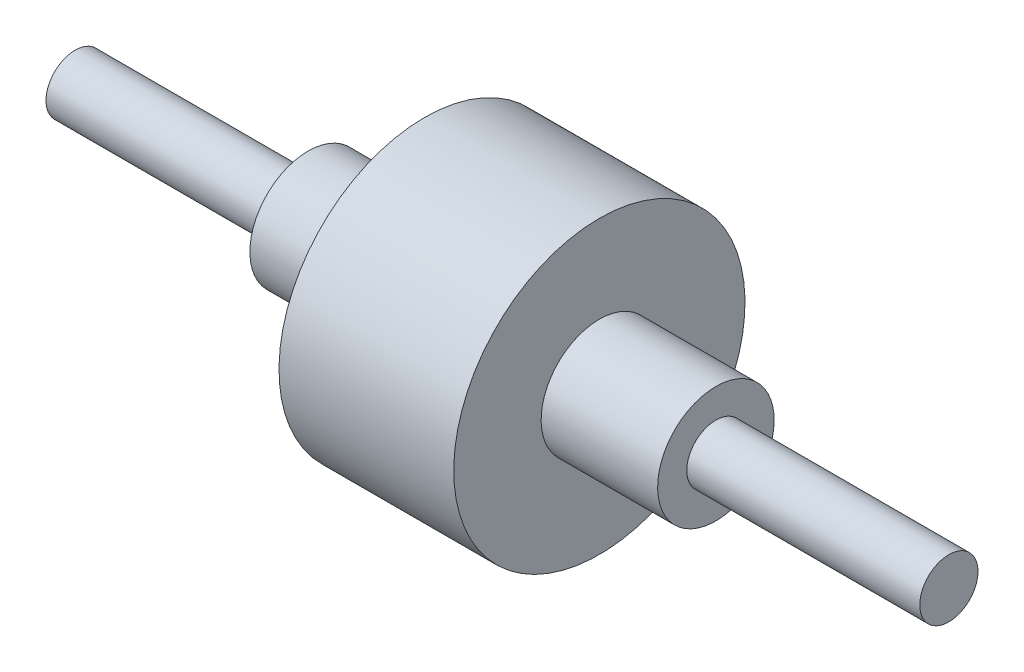
ISO-10303-21;
HEADER;
FILE_DESCRIPTION(('STEP AP214'),'2;1');
FILE_NAME('part.step','',(''),(''),'','','');
FILE_SCHEMA(('AUTOMOTIVE_DESIGN { 1 0 10303 214 1 1 1 1 }'));
ENDSEC;
DATA;
#1=APPLICATION_CONTEXT('core data for automotive mechanical design processes');
#2=APPLICATION_PROTOCOL_DEFINITION('international standard','automotive_design',2000,#1);
#3=PRODUCT_CONTEXT('',#1,'mechanical');
#4=PRODUCT('Part','Part','',(#3));
#5=PRODUCT_RELATED_PRODUCT_CATEGORY('part','',(#4));
#6=PRODUCT_DEFINITION_FORMATION('','',#4);
#7=PRODUCT_DEFINITION_CONTEXT('part definition',#1,'design');
#8=PRODUCT_DEFINITION('design','',#6,#7);
#9=PRODUCT_DEFINITION_SHAPE('','',#8);
#10=(LENGTH_UNIT() NAMED_UNIT(*) SI_UNIT(.MILLI.,.METRE.));
#11=(NAMED_UNIT(*) PLANE_ANGLE_UNIT() SI_UNIT($,.RADIAN.));
#12=(NAMED_UNIT(*) SI_UNIT($,.STERADIAN.) SOLID_ANGLE_UNIT());
#13=UNCERTAINTY_MEASURE_WITH_UNIT(LENGTH_MEASURE(1.E-05),#10,'distance_accuracy_value','');
#14=(GEOMETRIC_REPRESENTATION_CONTEXT(3) GLOBAL_UNCERTAINTY_ASSIGNED_CONTEXT((#13)) GLOBAL_UNIT_ASSIGNED_CONTEXT((#10,
#11,#12)) REPRESENTATION_CONTEXT('',''));
#15=CARTESIAN_POINT('',(0.,0.,0.));
#16=DIRECTION('',(0.,0.,1.));
#17=DIRECTION('',(1.,0.,0.));
#18=AXIS2_PLACEMENT_3D('',#15,#16,#17);
#19=CARTESIAN_POINT('',(-150.,0.,0.));
#20=DIRECTION('',(-1.,0.,0.));
#21=DIRECTION('',(0.,-1.,0.));
#22=AXIS2_PLACEMENT_3D('',#19,#20,#21);
#23=PLANE('',#22);
#24=CARTESIAN_POINT('',(-150.,0.,0.));
#25=DIRECTION('',(1.,0.,0.));
#26=DIRECTION('',(0.,1.,0.));
#27=AXIS2_PLACEMENT_3D('',#24,#25,#26);
#28=CIRCLE('',#27,10.);
#29=CARTESIAN_POINT('',(-150.,9.99999999999996,0.));
#30=VERTEX_POINT('',#29);
#31=EDGE_CURVE('E10',#30,#30,#28,.T.);
#32=ORIENTED_EDGE('',*,*,#31,.F.);
#33=EDGE_LOOP('',(#32));
#34=FACE_BOUND('',#33,.T.);
#35=ADVANCED_FACE('F34',(#34),#23,.T.);
#36=CARTESIAN_POINT('',(150.,0.,0.));
#37=DIRECTION('',(1.,0.,0.));
#38=DIRECTION('',(0.,1.,0.));
#39=AXIS2_PLACEMENT_3D('',#36,#37,#38);
#40=CYLINDRICAL_SURFACE('',#39,10.);
#41=ORIENTED_EDGE('',*,*,#31,.T.);
#42=EDGE_LOOP('',(#41));
#43=FACE_BOUND('',#42,.T.);
#44=CARTESIAN_POINT('',(-70.,0.,0.));
#45=DIRECTION('',(1.,0.,0.));
#46=DIRECTION('',(0.,1.,0.));
#47=AXIS2_PLACEMENT_3D('',#44,#45,#46);
#48=CIRCLE('',#47,10.);
#49=CARTESIAN_POINT('',(-70.,9.99999999999997,0.));
#50=VERTEX_POINT('',#49);
#51=EDGE_CURVE('E40',#50,#50,#48,.T.);
#52=ORIENTED_EDGE('',*,*,#51,.F.);
#53=EDGE_LOOP('',(#52));
#54=FACE_BOUND('',#53,.T.);
#55=ADVANCED_FACE('F88',(#43,#54),#40,.T.);
#56=CARTESIAN_POINT('',(-70.,9.99999999999997,0.));
#57=DIRECTION('',(-1.,0.,0.));
#58=DIRECTION('',(0.,-1.,0.));
#59=AXIS2_PLACEMENT_3D('',#56,#57,#58);
#60=PLANE('',#59);
#61=ORIENTED_EDGE('',*,*,#51,.T.);
#62=EDGE_LOOP('',(#61));
#63=FACE_BOUND('',#62,.T.);
#64=CARTESIAN_POINT('',(-70.,0.,0.));
#65=DIRECTION('',(1.,0.,0.));
#66=DIRECTION('',(0.,1.,0.));
#67=AXIS2_PLACEMENT_3D('',#64,#65,#66);
#68=CIRCLE('',#67,20.);
#69=CARTESIAN_POINT('',(-70.,20.,0.));
#70=VERTEX_POINT('',#69);
#71=EDGE_CURVE('E44',#70,#70,#68,.T.);
#72=ORIENTED_EDGE('',*,*,#71,.F.);
#73=EDGE_LOOP('',(#72));
#74=FACE_BOUND('',#73,.T.);
#75=ADVANCED_FACE('F93',(#63,#74),#60,.T.);
#76=CARTESIAN_POINT('',(150.,0.,0.));
#77=DIRECTION('',(1.,0.,0.));
#78=DIRECTION('',(0.,1.,0.));
#79=AXIS2_PLACEMENT_3D('',#76,#77,#78);
#80=CYLINDRICAL_SURFACE('',#79,20.);
#81=ORIENTED_EDGE('',*,*,#71,.T.);
#82=EDGE_LOOP('',(#81));
#83=FACE_BOUND('',#82,.T.);
#84=CARTESIAN_POINT('',(-30.,0.,0.));
#85=DIRECTION('',(1.,0.,0.));
#86=DIRECTION('',(0.,1.,0.));
#87=AXIS2_PLACEMENT_3D('',#84,#85,#86);
#88=CIRCLE('',#87,20.);
#89=CARTESIAN_POINT('',(-30.,20.,0.));
#90=VERTEX_POINT('',#89);
#91=EDGE_CURVE('E48',#90,#90,#88,.T.);
#92=ORIENTED_EDGE('',*,*,#91,.F.);
#93=EDGE_LOOP('',(#92));
#94=FACE_BOUND('',#93,.T.);
#95=ADVANCED_FACE('F97',(#83,#94),#80,.T.);
#96=CARTESIAN_POINT('',(-30.,20.,0.));
#97=DIRECTION('',(-1.,0.,0.));
#98=DIRECTION('',(0.,-1.,0.));
#99=AXIS2_PLACEMENT_3D('',#96,#97,#98);
#100=PLANE('',#99);
#101=ORIENTED_EDGE('',*,*,#91,.T.);
#102=EDGE_LOOP('',(#101));
#103=FACE_BOUND('',#102,.T.);
#104=CARTESIAN_POINT('',(-30.,0.,0.));
#105=DIRECTION('',(1.,0.,0.));
#106=DIRECTION('',(0.,1.,0.));
#107=AXIS2_PLACEMENT_3D('',#104,#105,#106);
#108=CIRCLE('',#107,50.);
#109=CARTESIAN_POINT('',(-30.,50.,0.));
#110=VERTEX_POINT('',#109);
#111=EDGE_CURVE('E53',#110,#110,#108,.T.);
#112=ORIENTED_EDGE('',*,*,#111,.F.);
#113=EDGE_LOOP('',(#112));
#114=FACE_BOUND('',#113,.T.);
#115=ADVANCED_FACE('F103',(#103,#114),#100,.T.);
#116=CARTESIAN_POINT('',(150.,0.,0.));
#117=DIRECTION('',(1.,0.,0.));
#118=DIRECTION('',(0.,1.,0.));
#119=AXIS2_PLACEMENT_3D('',#116,#117,#118);
#120=CYLINDRICAL_SURFACE('',#119,50.);
#121=ORIENTED_EDGE('',*,*,#111,.T.);
#122=EDGE_LOOP('',(#121));
#123=FACE_BOUND('',#122,.T.);
#124=CARTESIAN_POINT('',(30.,0.,0.));
#125=DIRECTION('',(1.,0.,0.));
#126=DIRECTION('',(0.,1.,0.));
#127=AXIS2_PLACEMENT_3D('',#124,#125,#126);
#128=CIRCLE('',#127,50.);
#129=CARTESIAN_POINT('',(30.,50.,0.));
#130=VERTEX_POINT('',#129);
#131=EDGE_CURVE('E56',#130,#130,#128,.T.);
#132=ORIENTED_EDGE('',*,*,#131,.F.);
#133=EDGE_LOOP('',(#132));
#134=FACE_BOUND('',#133,.T.);
#135=ADVANCED_FACE('F107',(#123,#134),#120,.T.);
#136=CARTESIAN_POINT('',(30.,20.,0.));
#137=DIRECTION('',(1.,0.,0.));
#138=DIRECTION('',(0.,1.,0.));
#139=AXIS2_PLACEMENT_3D('',#136,#137,#138);
#140=PLANE('',#139);
#141=ORIENTED_EDGE('',*,*,#131,.T.);
#142=EDGE_LOOP('',(#141));
#143=FACE_BOUND('',#142,.T.);
#144=CARTESIAN_POINT('',(30.,0.,0.));
#145=DIRECTION('',(1.,0.,0.));
#146=DIRECTION('',(0.,1.,0.));
#147=AXIS2_PLACEMENT_3D('',#144,#145,#146);
#148=CIRCLE('',#147,20.);
#149=CARTESIAN_POINT('',(30.,20.,0.));
#150=VERTEX_POINT('',#149);
#151=EDGE_CURVE('E59',#150,#150,#148,.T.);
#152=ORIENTED_EDGE('',*,*,#151,.F.);
#153=EDGE_LOOP('',(#152));
#154=FACE_BOUND('',#153,.T.);
#155=ADVANCED_FACE('F111',(#143,#154),#140,.T.);
#156=CARTESIAN_POINT('',(150.,0.,0.));
#157=DIRECTION('',(1.,0.,0.));
#158=DIRECTION('',(0.,1.,0.));
#159=AXIS2_PLACEMENT_3D('',#156,#157,#158);
#160=CYLINDRICAL_SURFACE('',#159,20.);
#161=ORIENTED_EDGE('',*,*,#151,.T.);
#162=EDGE_LOOP('',(#161));
#163=FACE_BOUND('',#162,.T.);
#164=CARTESIAN_POINT('',(70.,0.,0.));
#165=DIRECTION('',(1.,0.,0.));
#166=DIRECTION('',(0.,1.,0.));
#167=AXIS2_PLACEMENT_3D('',#164,#165,#166);
#168=CIRCLE('',#167,20.);
#169=CARTESIAN_POINT('',(70.,20.,0.));
#170=VERTEX_POINT('',#169);
#171=EDGE_CURVE('E62',#170,#170,#168,.T.);
#172=ORIENTED_EDGE('',*,*,#171,.F.);
#173=EDGE_LOOP('',(#172));
#174=FACE_BOUND('',#173,.T.);
#175=ADVANCED_FACE('F84',(#163,#174),#160,.T.);
#176=CARTESIAN_POINT('',(70.,9.99999999999999,0.));
#177=DIRECTION('',(1.,0.,0.));
#178=DIRECTION('',(0.,1.,0.));
#179=AXIS2_PLACEMENT_3D('',#176,#177,#178);
#180=PLANE('',#179);
#181=ORIENTED_EDGE('',*,*,#171,.T.);
#182=EDGE_LOOP('',(#181));
#183=FACE_BOUND('',#182,.T.);
#184=CARTESIAN_POINT('',(70.,0.,0.));
#185=DIRECTION('',(1.,0.,0.));
#186=DIRECTION('',(0.,1.,0.));
#187=AXIS2_PLACEMENT_3D('',#184,#185,#186);
#188=CIRCLE('',#187,10.);
#189=CARTESIAN_POINT('',(70.,9.99999999999999,0.));
#190=VERTEX_POINT('',#189);
#191=EDGE_CURVE('E65',#190,#190,#188,.T.);
#192=ORIENTED_EDGE('',*,*,#191,.F.);
#193=EDGE_LOOP('',(#192));
#194=FACE_BOUND('',#193,.T.);
#195=ADVANCED_FACE('F76',(#183,#194),#180,.T.);
#196=CARTESIAN_POINT('',(150.,0.,0.));
#197=DIRECTION('',(1.,0.,0.));
#198=DIRECTION('',(0.,1.,0.));
#199=AXIS2_PLACEMENT_3D('',#196,#197,#198);
#200=CYLINDRICAL_SURFACE('',#199,10.);
#201=ORIENTED_EDGE('',*,*,#191,.T.);
#202=EDGE_LOOP('',(#201));
#203=FACE_BOUND('',#202,.T.);
#204=CARTESIAN_POINT('',(150.,0.,0.));
#205=DIRECTION('',(1.,0.,0.));
#206=DIRECTION('',(0.,1.,0.));
#207=AXIS2_PLACEMENT_3D('',#204,#205,#206);
#208=CIRCLE('',#207,10.);
#209=CARTESIAN_POINT('',(150.,10.,0.));
#210=VERTEX_POINT('',#209);
#211=EDGE_CURVE('E68',#210,#210,#208,.T.);
#212=ORIENTED_EDGE('',*,*,#211,.F.);
#213=EDGE_LOOP('',(#212));
#214=FACE_BOUND('',#213,.T.);
#215=ADVANCED_FACE('F74',(#203,#214),#200,.T.);
#216=CARTESIAN_POINT('',(150.,0.,0.));
#217=DIRECTION('',(1.,0.,0.));
#218=DIRECTION('',(0.,1.,0.));
#219=AXIS2_PLACEMENT_3D('',#216,#217,#218);
#220=PLANE('',#219);
#221=ORIENTED_EDGE('',*,*,#211,.T.);
#222=EDGE_LOOP('',(#221));
#223=FACE_BOUND('',#222,.T.);
#224=ADVANCED_FACE('F72',(#223),#220,.T.);
#225=CLOSED_SHELL('',(#35,#55,#75,#95,#115,#135,#155,#175,#195,#215,#224));
#226=MANIFOLD_SOLID_BREP('B2',#225);
#227=ADVANCED_BREP_SHAPE_REPRESENTATION('',(#18,#226),#14);
#228=SHAPE_DEFINITION_REPRESENTATION(#9,#227);
ENDSEC;
END-ISO-10303-21;
